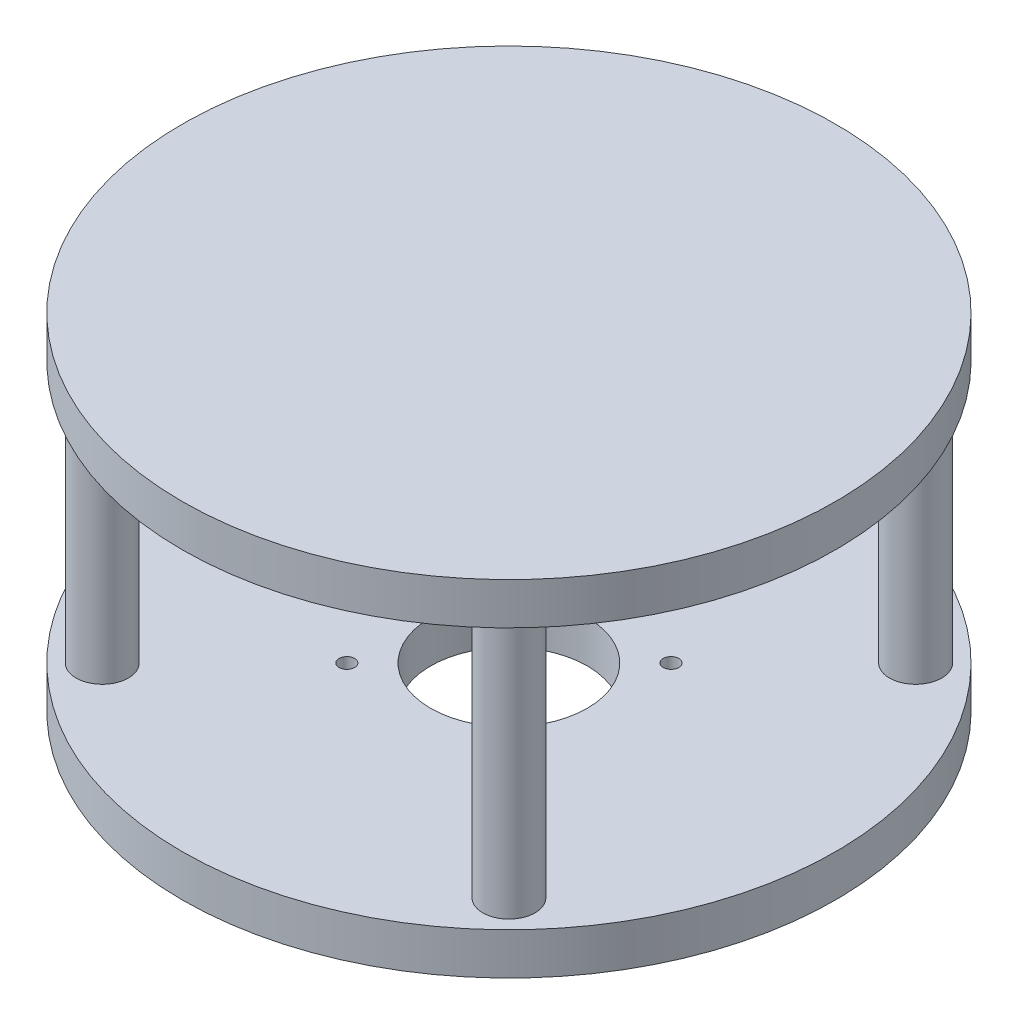
ISO-10303-21;
HEADER;
FILE_DESCRIPTION(('STEP AP214'),'2;1');
FILE_NAME('part.step','',(''),(''),'','','');
FILE_SCHEMA(('AUTOMOTIVE_DESIGN { 1 0 10303 214 1 1 1 1 }'));
ENDSEC;
DATA;
#1=APPLICATION_CONTEXT('core data for automotive mechanical design processes');
#2=APPLICATION_PROTOCOL_DEFINITION('international standard','automotive_design',2000,#1);
#3=PRODUCT_CONTEXT('',#1,'mechanical');
#4=PRODUCT('Part','Part','',(#3));
#5=PRODUCT_RELATED_PRODUCT_CATEGORY('part','',(#4));
#6=PRODUCT_DEFINITION_FORMATION('','',#4);
#7=PRODUCT_DEFINITION_CONTEXT('part definition',#1,'design');
#8=PRODUCT_DEFINITION('design','',#6,#7);
#9=PRODUCT_DEFINITION_SHAPE('','',#8);
#10=(LENGTH_UNIT() NAMED_UNIT(*) SI_UNIT(.MILLI.,.METRE.));
#11=(NAMED_UNIT(*) PLANE_ANGLE_UNIT() SI_UNIT($,.RADIAN.));
#12=(NAMED_UNIT(*) SI_UNIT($,.STERADIAN.) SOLID_ANGLE_UNIT());
#13=UNCERTAINTY_MEASURE_WITH_UNIT(LENGTH_MEASURE(1.E-05),#10,'distance_accuracy_value','');
#14=(GEOMETRIC_REPRESENTATION_CONTEXT(3) GLOBAL_UNCERTAINTY_ASSIGNED_CONTEXT((#13)) GLOBAL_UNIT_ASSIGNED_CONTEXT((#10,
#11,#12)) REPRESENTATION_CONTEXT('',''));
#15=CARTESIAN_POINT('',(0.,0.,0.));
#16=DIRECTION('',(0.,0.,1.));
#17=DIRECTION('',(1.,0.,0.));
#18=AXIS2_PLACEMENT_3D('',#15,#16,#17);
#19=CARTESIAN_POINT('',(0.,8.,0.));
#20=DIRECTION('',(0.,-1.,0.));
#21=DIRECTION('',(0.,0.,-1.));
#22=AXIS2_PLACEMENT_3D('',#19,#20,#21);
#23=CYLINDRICAL_SURFACE('',#22,62.5);
#24=CARTESIAN_POINT('',(0.,8.,0.));
#25=DIRECTION('',(0.,1.,0.));
#26=DIRECTION('',(0.,0.,1.));
#27=AXIS2_PLACEMENT_3D('',#24,#25,#26);
#28=CIRCLE('',#27,62.5);
#29=CARTESIAN_POINT('',(0.,8.,62.5));
#30=VERTEX_POINT('',#29);
#31=EDGE_CURVE('E10',#30,#30,#28,.T.);
#32=ORIENTED_EDGE('',*,*,#31,.F.);
#33=EDGE_LOOP('',(#32));
#34=FACE_BOUND('',#33,.T.);
#35=CARTESIAN_POINT('',(0.,0.,0.));
#36=DIRECTION('',(0.,1.,0.));
#37=DIRECTION('',(0.,0.,1.));
#38=AXIS2_PLACEMENT_3D('',#35,#36,#37);
#39=CIRCLE('',#38,62.5);
#40=CARTESIAN_POINT('',(0.,0.,62.5));
#41=VERTEX_POINT('',#40);
#42=EDGE_CURVE('E36',#41,#41,#39,.T.);
#43=ORIENTED_EDGE('',*,*,#42,.T.);
#44=EDGE_LOOP('',(#43));
#45=FACE_BOUND('',#44,.T.);
#46=ADVANCED_FACE('F33',(#34,#45),#23,.T.);
#47=CARTESIAN_POINT('',(0.,8.,0.));
#48=DIRECTION('',(0.,1.,0.));
#49=DIRECTION('',(0.,0.,1.));
#50=AXIS2_PLACEMENT_3D('',#47,#48,#49);
#51=PLANE('',#50);
#52=CARTESIAN_POINT('',(-15.5,8.,-15.5));
#53=DIRECTION('',(0.,1.,0.));
#54=DIRECTION('',(0.,0.,1.));
#55=AXIS2_PLACEMENT_3D('',#52,#53,#54);
#56=CIRCLE('',#55,1.5);
#57=CARTESIAN_POINT('',(-15.5,8.,-14.));
#58=VERTEX_POINT('',#57);
#59=EDGE_CURVE('E90',#58,#58,#56,.F.);
#60=ORIENTED_EDGE('',*,*,#59,.T.);
#61=EDGE_LOOP('',(#60));
#62=FACE_BOUND('',#61,.T.);
#63=CARTESIAN_POINT('',(15.5,8.,15.5));
#64=DIRECTION('',(0.,1.,0.));
#65=DIRECTION('',(0.,0.,1.));
#66=AXIS2_PLACEMENT_3D('',#63,#64,#65);
#67=CIRCLE('',#66,1.5);
#68=CARTESIAN_POINT('',(15.5,8.,17.));
#69=VERTEX_POINT('',#68);
#70=EDGE_CURVE('E91',#69,#69,#67,.F.);
#71=ORIENTED_EDGE('',*,*,#70,.T.);
#72=EDGE_LOOP('',(#71));
#73=FACE_BOUND('',#72,.T.);
#74=CARTESIAN_POINT('',(15.5,8.,-15.5));
#75=DIRECTION('',(0.,1.,0.));
#76=DIRECTION('',(0.,0.,1.));
#77=AXIS2_PLACEMENT_3D('',#74,#75,#76);
#78=CIRCLE('',#77,1.5);
#79=CARTESIAN_POINT('',(15.5,8.,-14.));
#80=VERTEX_POINT('',#79);
#81=EDGE_CURVE('E101',#80,#80,#78,.F.);
#82=ORIENTED_EDGE('',*,*,#81,.T.);
#83=EDGE_LOOP('',(#82));
#84=FACE_BOUND('',#83,.T.);
#85=CARTESIAN_POINT('',(-15.5,8.,15.5));
#86=DIRECTION('',(0.,1.,0.));
#87=DIRECTION('',(0.,0.,1.));
#88=AXIS2_PLACEMENT_3D('',#85,#86,#87);
#89=CIRCLE('',#88,1.5);
#90=CARTESIAN_POINT('',(-15.5,8.,17.));
#91=VERTEX_POINT('',#90);
#92=EDGE_CURVE('E83',#91,#91,#89,.F.);
#93=ORIENTED_EDGE('',*,*,#92,.T.);
#94=EDGE_LOOP('',(#93));
#95=FACE_BOUND('',#94,.T.);
#96=CARTESIAN_POINT('',(0.,8.,0.));
#97=DIRECTION('',(0.,1.,0.));
#98=DIRECTION('',(0.,0.,1.));
#99=AXIS2_PLACEMENT_3D('',#96,#97,#98);
#100=CIRCLE('',#99,15.);
#101=CARTESIAN_POINT('',(0.,8.,15.));
#102=VERTEX_POINT('',#101);
#103=EDGE_CURVE('E77',#102,#102,#100,.F.);
#104=ORIENTED_EDGE('',*,*,#103,.T.);
#105=EDGE_LOOP('',(#104));
#106=FACE_BOUND('',#105,.T.);
#107=CARTESIAN_POINT('',(-38.8908729652604,8.,-38.8908729652599));
#108=DIRECTION('',(0.,1.,0.));
#109=DIRECTION('',(0.,0.,1.));
#110=AXIS2_PLACEMENT_3D('',#107,#108,#109);
#111=CIRCLE('',#110,5.);
#112=CARTESIAN_POINT('',(-38.8908729652604,8.,-33.8908729652599));
#113=VERTEX_POINT('',#112);
#114=EDGE_CURVE('E63',#113,#113,#111,.T.);
#115=ORIENTED_EDGE('',*,*,#114,.F.);
#116=EDGE_LOOP('',(#115));
#117=FACE_BOUND('',#116,.T.);
#118=CARTESIAN_POINT('',(-38.8908729652599,8.,38.8908729652604));
#119=DIRECTION('',(0.,1.,0.));
#120=DIRECTION('',(0.,0.,1.));
#121=AXIS2_PLACEMENT_3D('',#118,#119,#120);
#122=CIRCLE('',#121,5.00000000000001);
#123=CARTESIAN_POINT('',(-38.8908729652599,8.,43.8908729652604));
#124=VERTEX_POINT('',#123);
#125=EDGE_CURVE('E57',#124,#124,#122,.T.);
#126=ORIENTED_EDGE('',*,*,#125,.F.);
#127=EDGE_LOOP('',(#126));
#128=FACE_BOUND('',#127,.T.);
#129=CARTESIAN_POINT('',(38.8908729652604,8.,38.8908729652599));
#130=DIRECTION('',(0.,1.,0.));
#131=DIRECTION('',(0.,0.,1.));
#132=AXIS2_PLACEMENT_3D('',#129,#130,#131);
#133=CIRCLE('',#132,5.);
#134=CARTESIAN_POINT('',(38.8908729652604,8.,43.8908729652599));
#135=VERTEX_POINT('',#134);
#136=EDGE_CURVE('E51',#135,#135,#133,.T.);
#137=ORIENTED_EDGE('',*,*,#136,.F.);
#138=EDGE_LOOP('',(#137));
#139=FACE_BOUND('',#138,.T.);
#140=CARTESIAN_POINT('',(38.8908729652599,8.,-38.8908729652604));
#141=DIRECTION('',(0.,1.,0.));
#142=DIRECTION('',(0.,0.,1.));
#143=AXIS2_PLACEMENT_3D('',#140,#141,#142);
#144=CIRCLE('',#143,4.99999999999997);
#145=CARTESIAN_POINT('',(38.8908729652599,8.,-33.8908729652604));
#146=VERTEX_POINT('',#145);
#147=EDGE_CURVE('E45',#146,#146,#144,.T.);
#148=ORIENTED_EDGE('',*,*,#147,.F.);
#149=EDGE_LOOP('',(#148));
#150=FACE_BOUND('',#149,.T.);
#151=ORIENTED_EDGE('',*,*,#31,.T.);
#152=EDGE_LOOP('',(#151));
#153=FACE_BOUND('',#152,.T.);
#154=ADVANCED_FACE('F105',(#62,#73,#84,#95,#106,#117,#128,#139,#150,#153),#51,.T.);
#155=CARTESIAN_POINT('',(0.,0.,0.));
#156=DIRECTION('',(0.,1.,0.));
#157=DIRECTION('',(0.,0.,1.));
#158=AXIS2_PLACEMENT_3D('',#155,#156,#157);
#159=PLANE('',#158);
#160=CARTESIAN_POINT('',(-15.5,0.,-15.5));
#161=DIRECTION('',(0.,-1.,0.));
#162=DIRECTION('',(0.,0.,1.));
#163=AXIS2_PLACEMENT_3D('',#160,#161,#162);
#164=CIRCLE('',#163,1.5);
#165=CARTESIAN_POINT('',(-15.5,0.,-14.));
#166=VERTEX_POINT('',#165);
#167=EDGE_CURVE('E86',#166,#166,#164,.T.);
#168=ORIENTED_EDGE('',*,*,#167,.F.);
#169=EDGE_LOOP('',(#168));
#170=FACE_BOUND('',#169,.T.);
#171=CARTESIAN_POINT('',(15.5,0.,15.5));
#172=DIRECTION('',(0.,-1.,0.));
#173=DIRECTION('',(0.,0.,1.));
#174=AXIS2_PLACEMENT_3D('',#171,#172,#173);
#175=CIRCLE('',#174,1.5);
#176=CARTESIAN_POINT('',(15.5,0.,17.));
#177=VERTEX_POINT('',#176);
#178=EDGE_CURVE('E87',#177,#177,#175,.T.);
#179=ORIENTED_EDGE('',*,*,#178,.F.);
#180=EDGE_LOOP('',(#179));
#181=FACE_BOUND('',#180,.T.);
#182=CARTESIAN_POINT('',(15.5,0.,-15.5));
#183=DIRECTION('',(0.,-1.,0.));
#184=DIRECTION('',(0.,0.,-1.));
#185=AXIS2_PLACEMENT_3D('',#182,#183,#184);
#186=CIRCLE('',#185,1.5);
#187=CARTESIAN_POINT('',(15.5,0.,-17.));
#188=VERTEX_POINT('',#187);
#189=EDGE_CURVE('E94',#188,#188,#186,.T.);
#190=ORIENTED_EDGE('',*,*,#189,.F.);
#191=EDGE_LOOP('',(#190));
#192=FACE_BOUND('',#191,.T.);
#193=CARTESIAN_POINT('',(-15.5,0.,15.5));
#194=DIRECTION('',(0.,-1.,0.));
#195=DIRECTION('',(0.,0.,-1.));
#196=AXIS2_PLACEMENT_3D('',#193,#194,#195);
#197=CIRCLE('',#196,1.5);
#198=CARTESIAN_POINT('',(-15.5,0.,14.));
#199=VERTEX_POINT('',#198);
#200=EDGE_CURVE('E80',#199,#199,#197,.T.);
#201=ORIENTED_EDGE('',*,*,#200,.F.);
#202=EDGE_LOOP('',(#201));
#203=FACE_BOUND('',#202,.T.);
#204=CARTESIAN_POINT('',(0.,0.,0.));
#205=DIRECTION('',(0.,-1.,0.));
#206=DIRECTION('',(0.,0.,-1.));
#207=AXIS2_PLACEMENT_3D('',#204,#205,#206);
#208=CIRCLE('',#207,15.);
#209=CARTESIAN_POINT('',(0.,0.,-15.));
#210=VERTEX_POINT('',#209);
#211=EDGE_CURVE('E72',#210,#210,#208,.T.);
#212=ORIENTED_EDGE('',*,*,#211,.F.);
#213=EDGE_LOOP('',(#212));
#214=FACE_BOUND('',#213,.T.);
#215=ORIENTED_EDGE('',*,*,#42,.F.);
#216=EDGE_LOOP('',(#215));
#217=FACE_BOUND('',#216,.T.);
#218=ADVANCED_FACE('F116',(#170,#181,#192,#203,#214,#217),#159,.F.);
#219=CARTESIAN_POINT('',(38.8908729652599,58.,-38.8908729652604));
#220=DIRECTION('',(0.,-1.,0.));
#221=DIRECTION('',(0.,0.,-1.));
#222=AXIS2_PLACEMENT_3D('',#219,#220,#221);
#223=CYLINDRICAL_SURFACE('',#222,4.99999999999997);
#224=CARTESIAN_POINT('',(38.8908729652599,58.,-38.8908729652604));
#225=DIRECTION('',(0.,1.,0.));
#226=DIRECTION('',(0.,0.,1.));
#227=AXIS2_PLACEMENT_3D('',#224,#225,#226);
#228=CIRCLE('',#227,4.99999999999997);
#229=CARTESIAN_POINT('',(38.8908729652599,58.,-33.8908729652604));
#230=VERTEX_POINT('',#229);
#231=EDGE_CURVE('E43',#230,#230,#228,.T.);
#232=ORIENTED_EDGE('',*,*,#231,.F.);
#233=EDGE_LOOP('',(#232));
#234=FACE_BOUND('',#233,.T.);
#235=ORIENTED_EDGE('',*,*,#147,.T.);
#236=EDGE_LOOP('',(#235));
#237=FACE_BOUND('',#236,.T.);
#238=ADVANCED_FACE('F119',(#234,#237),#223,.T.);
#239=CARTESIAN_POINT('',(38.8908729652604,58.,38.8908729652599));
#240=DIRECTION('',(0.,-1.,0.));
#241=DIRECTION('',(0.,0.,-1.));
#242=AXIS2_PLACEMENT_3D('',#239,#240,#241);
#243=CYLINDRICAL_SURFACE('',#242,5.);
#244=CARTESIAN_POINT('',(38.8908729652604,58.,38.8908729652599));
#245=DIRECTION('',(0.,1.,0.));
#246=DIRECTION('',(0.,0.,1.));
#247=AXIS2_PLACEMENT_3D('',#244,#245,#246);
#248=CIRCLE('',#247,5.);
#249=CARTESIAN_POINT('',(38.8908729652604,58.,43.8908729652599));
#250=VERTEX_POINT('',#249);
#251=EDGE_CURVE('E48',#250,#250,#248,.T.);
#252=ORIENTED_EDGE('',*,*,#251,.F.);
#253=EDGE_LOOP('',(#252));
#254=FACE_BOUND('',#253,.T.);
#255=ORIENTED_EDGE('',*,*,#136,.T.);
#256=EDGE_LOOP('',(#255));
#257=FACE_BOUND('',#256,.T.);
#258=ADVANCED_FACE('F140',(#254,#257),#243,.T.);
#259=CARTESIAN_POINT('',(-38.8908729652599,58.,38.8908729652604));
#260=DIRECTION('',(0.,-1.,0.));
#261=DIRECTION('',(0.,0.,-1.));
#262=AXIS2_PLACEMENT_3D('',#259,#260,#261);
#263=CYLINDRICAL_SURFACE('',#262,5.00000000000001);
#264=CARTESIAN_POINT('',(-38.8908729652599,58.,38.8908729652604));
#265=DIRECTION('',(0.,1.,0.));
#266=DIRECTION('',(0.,0.,1.));
#267=AXIS2_PLACEMENT_3D('',#264,#265,#266);
#268=CIRCLE('',#267,5.00000000000001);
#269=CARTESIAN_POINT('',(-38.8908729652599,58.,43.8908729652604));
#270=VERTEX_POINT('',#269);
#271=EDGE_CURVE('E54',#270,#270,#268,.T.);
#272=ORIENTED_EDGE('',*,*,#271,.F.);
#273=EDGE_LOOP('',(#272));
#274=FACE_BOUND('',#273,.T.);
#275=ORIENTED_EDGE('',*,*,#125,.T.);
#276=EDGE_LOOP('',(#275));
#277=FACE_BOUND('',#276,.T.);
#278=ADVANCED_FACE('F144',(#274,#277),#263,.T.);
#279=CARTESIAN_POINT('',(-38.8908729652604,58.,-38.8908729652599));
#280=DIRECTION('',(0.,-1.,0.));
#281=DIRECTION('',(0.,0.,-1.));
#282=AXIS2_PLACEMENT_3D('',#279,#280,#281);
#283=CYLINDRICAL_SURFACE('',#282,5.);
#284=CARTESIAN_POINT('',(-38.8908729652604,58.,-38.8908729652599));
#285=DIRECTION('',(0.,1.,0.));
#286=DIRECTION('',(0.,0.,1.));
#287=AXIS2_PLACEMENT_3D('',#284,#285,#286);
#288=CIRCLE('',#287,5.);
#289=CARTESIAN_POINT('',(-38.8908729652604,58.,-33.8908729652599));
#290=VERTEX_POINT('',#289);
#291=EDGE_CURVE('E60',#290,#290,#288,.T.);
#292=ORIENTED_EDGE('',*,*,#291,.F.);
#293=EDGE_LOOP('',(#292));
#294=FACE_BOUND('',#293,.T.);
#295=ORIENTED_EDGE('',*,*,#114,.T.);
#296=EDGE_LOOP('',(#295));
#297=FACE_BOUND('',#296,.T.);
#298=ADVANCED_FACE('F148',(#294,#297),#283,.T.);
#299=CARTESIAN_POINT('',(0.,66.,0.));
#300=DIRECTION('',(0.,-1.,0.));
#301=DIRECTION('',(0.,0.,-1.));
#302=AXIS2_PLACEMENT_3D('',#299,#300,#301);
#303=CYLINDRICAL_SURFACE('',#302,62.5);
#304=CARTESIAN_POINT('',(0.,66.,0.));
#305=DIRECTION('',(0.,1.,0.));
#306=DIRECTION('',(0.,0.,1.));
#307=AXIS2_PLACEMENT_3D('',#304,#305,#306);
#308=CIRCLE('',#307,62.5);
#309=CARTESIAN_POINT('',(0.,66.,62.5));
#310=VERTEX_POINT('',#309);
#311=EDGE_CURVE('E66',#310,#310,#308,.T.);
#312=ORIENTED_EDGE('',*,*,#311,.F.);
#313=EDGE_LOOP('',(#312));
#314=FACE_BOUND('',#313,.T.);
#315=CARTESIAN_POINT('',(0.,58.,0.));
#316=DIRECTION('',(0.,1.,0.));
#317=DIRECTION('',(0.,0.,1.));
#318=AXIS2_PLACEMENT_3D('',#315,#316,#317);
#319=CIRCLE('',#318,62.5);
#320=CARTESIAN_POINT('',(0.,58.,62.5));
#321=VERTEX_POINT('',#320);
#322=EDGE_CURVE('E69',#321,#321,#319,.T.);
#323=ORIENTED_EDGE('',*,*,#322,.T.);
#324=EDGE_LOOP('',(#323));
#325=FACE_BOUND('',#324,.T.);
#326=ADVANCED_FACE('F152',(#314,#325),#303,.T.);
#327=CARTESIAN_POINT('',(0.,66.,0.));
#328=DIRECTION('',(0.,1.,0.));
#329=DIRECTION('',(0.,0.,1.));
#330=AXIS2_PLACEMENT_3D('',#327,#328,#329);
#331=PLANE('',#330);
#332=ORIENTED_EDGE('',*,*,#311,.T.);
#333=EDGE_LOOP('',(#332));
#334=FACE_BOUND('',#333,.T.);
#335=ADVANCED_FACE('F156',(#334),#331,.T.);
#336=CARTESIAN_POINT('',(0.,58.,0.));
#337=DIRECTION('',(0.,1.,0.));
#338=DIRECTION('',(0.,0.,1.));
#339=AXIS2_PLACEMENT_3D('',#336,#337,#338);
#340=PLANE('',#339);
#341=ORIENTED_EDGE('',*,*,#231,.T.);
#342=EDGE_LOOP('',(#341));
#343=FACE_BOUND('',#342,.T.);
#344=ORIENTED_EDGE('',*,*,#251,.T.);
#345=EDGE_LOOP('',(#344));
#346=FACE_BOUND('',#345,.T.);
#347=ORIENTED_EDGE('',*,*,#271,.T.);
#348=EDGE_LOOP('',(#347));
#349=FACE_BOUND('',#348,.T.);
#350=ORIENTED_EDGE('',*,*,#291,.T.);
#351=EDGE_LOOP('',(#350));
#352=FACE_BOUND('',#351,.T.);
#353=ORIENTED_EDGE('',*,*,#322,.F.);
#354=EDGE_LOOP('',(#353));
#355=FACE_BOUND('',#354,.T.);
#356=ADVANCED_FACE('F158',(#343,#346,#349,#352,#355),#340,.F.);
#357=CARTESIAN_POINT('',(0.,66.001,0.));
#358=DIRECTION('',(0.,-1.,0.));
#359=DIRECTION('',(0.,0.,-1.));
#360=AXIS2_PLACEMENT_3D('',#357,#358,#359);
#361=CYLINDRICAL_SURFACE('',#360,15.);
#362=ORIENTED_EDGE('',*,*,#103,.F.);
#363=EDGE_LOOP('',(#362));
#364=FACE_BOUND('',#363,.T.);
#365=ORIENTED_EDGE('',*,*,#211,.T.);
#366=EDGE_LOOP('',(#365));
#367=FACE_BOUND('',#366,.T.);
#368=ADVANCED_FACE('F161',(#364,#367),#361,.F.);
#369=CARTESIAN_POINT('',(-15.5,66.001,15.5));
#370=DIRECTION('',(0.,-1.,0.));
#371=DIRECTION('',(0.,0.,-1.));
#372=AXIS2_PLACEMENT_3D('',#369,#370,#371);
#373=CYLINDRICAL_SURFACE('',#372,1.5);
#374=ORIENTED_EDGE('',*,*,#92,.F.);
#375=EDGE_LOOP('',(#374));
#376=FACE_BOUND('',#375,.T.);
#377=ORIENTED_EDGE('',*,*,#200,.T.);
#378=EDGE_LOOP('',(#377));
#379=FACE_BOUND('',#378,.T.);
#380=ADVANCED_FACE('F112',(#376,#379),#373,.F.);
#381=CARTESIAN_POINT('',(15.5,66.001,-15.5));
#382=DIRECTION('',(0.,-1.,0.));
#383=DIRECTION('',(0.,0.,-1.));
#384=AXIS2_PLACEMENT_3D('',#381,#382,#383);
#385=CYLINDRICAL_SURFACE('',#384,1.5);
#386=ORIENTED_EDGE('',*,*,#81,.F.);
#387=EDGE_LOOP('',(#386));
#388=FACE_BOUND('',#387,.T.);
#389=ORIENTED_EDGE('',*,*,#189,.T.);
#390=EDGE_LOOP('',(#389));
#391=FACE_BOUND('',#390,.T.);
#392=ADVANCED_FACE('F108',(#388,#391),#385,.F.);
#393=CARTESIAN_POINT('',(15.5,66.001,15.5));
#394=DIRECTION('',(0.,-1.,0.));
#395=DIRECTION('',(0.,0.,-1.));
#396=AXIS2_PLACEMENT_3D('',#393,#394,#395);
#397=CYLINDRICAL_SURFACE('',#396,1.5);
#398=ORIENTED_EDGE('',*,*,#70,.F.);
#399=EDGE_LOOP('',(#398));
#400=FACE_BOUND('',#399,.T.);
#401=ORIENTED_EDGE('',*,*,#178,.T.);
#402=EDGE_LOOP('',(#401));
#403=FACE_BOUND('',#402,.T.);
#404=ADVANCED_FACE('F111',(#400,#403),#397,.F.);
#405=CARTESIAN_POINT('',(-15.5,66.001,-15.5));
#406=DIRECTION('',(0.,-1.,0.));
#407=DIRECTION('',(0.,0.,-1.));
#408=AXIS2_PLACEMENT_3D('',#405,#406,#407);
#409=CYLINDRICAL_SURFACE('',#408,1.5);
#410=ORIENTED_EDGE('',*,*,#59,.F.);
#411=EDGE_LOOP('',(#410));
#412=FACE_BOUND('',#411,.T.);
#413=ORIENTED_EDGE('',*,*,#167,.T.);
#414=EDGE_LOOP('',(#413));
#415=FACE_BOUND('',#414,.T.);
#416=ADVANCED_FACE('F174',(#412,#415),#409,.F.);
#417=CLOSED_SHELL('',(#46,#154,#218,#238,#258,#278,#298,#326,#335,#356,#368,#380,#392,#404,#416));
#418=MANIFOLD_SOLID_BREP('B2',#417);
#419=ADVANCED_BREP_SHAPE_REPRESENTATION('',(#18,#418),#14);
#420=SHAPE_DEFINITION_REPRESENTATION(#9,#419);
ENDSEC;
END-ISO-10303-21;
